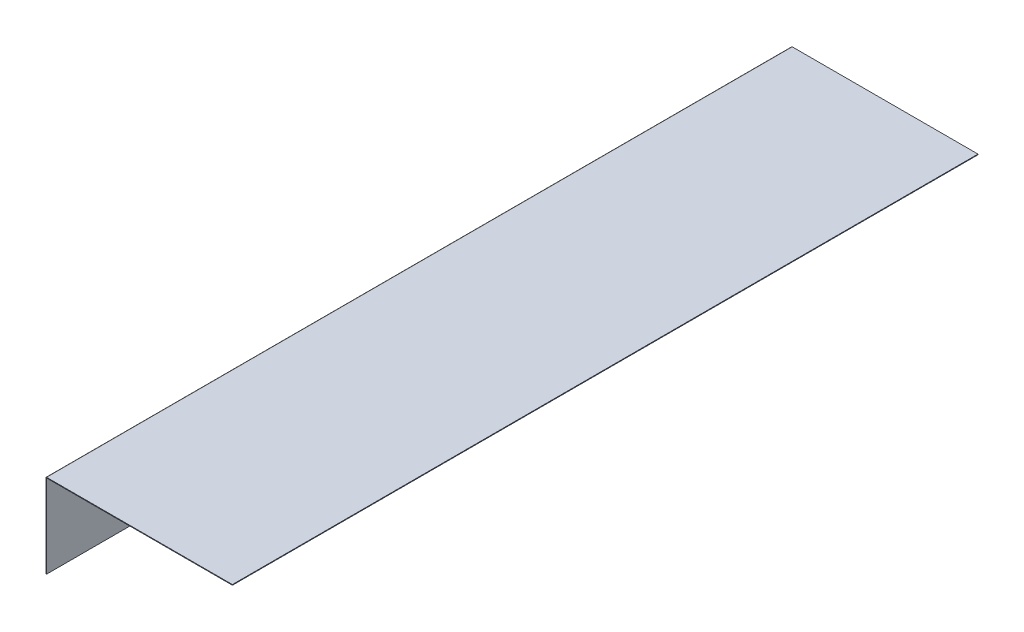
ISO-10303-21;
HEADER;
FILE_DESCRIPTION(('STEP AP214'),'2;1');
FILE_NAME('part.step','',(''),(''),'','','');
FILE_SCHEMA(('AUTOMOTIVE_DESIGN { 1 0 10303 214 1 1 1 1 }'));
ENDSEC;
DATA;
#1=APPLICATION_CONTEXT('core data for automotive mechanical design processes');
#2=APPLICATION_PROTOCOL_DEFINITION('international standard','automotive_design',2000,#1);
#3=PRODUCT_CONTEXT('',#1,'mechanical');
#4=PRODUCT('Part','Part','',(#3));
#5=PRODUCT_RELATED_PRODUCT_CATEGORY('part','',(#4));
#6=PRODUCT_DEFINITION_FORMATION('','',#4);
#7=PRODUCT_DEFINITION_CONTEXT('part definition',#1,'design');
#8=PRODUCT_DEFINITION('design','',#6,#7);
#9=PRODUCT_DEFINITION_SHAPE('','',#8);
#10=(LENGTH_UNIT() NAMED_UNIT(*) SI_UNIT(.MILLI.,.METRE.));
#11=(NAMED_UNIT(*) PLANE_ANGLE_UNIT() SI_UNIT($,.RADIAN.));
#12=(NAMED_UNIT(*) SI_UNIT($,.STERADIAN.) SOLID_ANGLE_UNIT());
#13=UNCERTAINTY_MEASURE_WITH_UNIT(LENGTH_MEASURE(1.E-05),#10,'distance_accuracy_value','');
#14=(GEOMETRIC_REPRESENTATION_CONTEXT(3) GLOBAL_UNCERTAINTY_ASSIGNED_CONTEXT((#13)) GLOBAL_UNIT_ASSIGNED_CONTEXT((#10,
#11,#12)) REPRESENTATION_CONTEXT('',''));
#15=CARTESIAN_POINT('',(0.,0.,0.));
#16=DIRECTION('',(0.,0.,1.));
#17=DIRECTION('',(1.,0.,0.));
#18=AXIS2_PLACEMENT_3D('',#15,#16,#17);
#19=CARTESIAN_POINT('',(1.,0.,1200.));
#20=DIRECTION('',(0.,1.,0.));
#21=DIRECTION('',(-1.,0.,0.));
#22=AXIS2_PLACEMENT_3D('',#19,#20,#21);
#23=PLANE('',#22);
#24=DIRECTION('',(1.,0.,0.));
#25=VECTOR('',#24,1.);
#26=CARTESIAN_POINT('',(1.,0.,0.));
#27=LINE('',#26,#25);
#28=CARTESIAN_POINT('',(0.,0.,0.));
#29=VERTEX_POINT('',#28);
#30=CARTESIAN_POINT('',(1.,0.,0.));
#31=VERTEX_POINT('',#30);
#32=EDGE_CURVE('E114',#29,#31,#27,.T.);
#33=ORIENTED_EDGE('',*,*,#32,.T.);
#34=DIRECTION('',(0.,0.,-1.));
#35=VECTOR('',#34,1.);
#36=CARTESIAN_POINT('',(1.,0.,1200.));
#37=LINE('',#36,#35);
#38=CARTESIAN_POINT('',(1.,0.,1200.));
#39=VERTEX_POINT('',#38);
#40=EDGE_CURVE('E98',#39,#31,#37,.T.);
#41=ORIENTED_EDGE('',*,*,#40,.F.);
#42=DIRECTION('',(1.,0.,0.));
#43=VECTOR('',#42,1.);
#44=CARTESIAN_POINT('',(1.,0.,1200.));
#45=LINE('',#44,#43);
#46=CARTESIAN_POINT('',(0.,0.,1200.));
#47=VERTEX_POINT('',#46);
#48=EDGE_CURVE('E101',#47,#39,#45,.T.);
#49=ORIENTED_EDGE('',*,*,#48,.F.);
#50=DIRECTION('',(0.,0.,-1.));
#51=VECTOR('',#50,1.);
#52=CARTESIAN_POINT('',(0.,0.,1200.));
#53=LINE('',#52,#51);
#54=EDGE_CURVE('E155',#47,#29,#53,.T.);
#55=ORIENTED_EDGE('',*,*,#54,.T.);
#56=EDGE_LOOP('',(#33,#41,#49,#55));
#57=FACE_BOUND('',#56,.T.);
#58=ADVANCED_FACE('F32',(#57),#23,.F.);
#59=CARTESIAN_POINT('',(1.,134.,1200.));
#60=DIRECTION('',(-1.,0.,0.));
#61=DIRECTION('',(0.,-1.,0.));
#62=AXIS2_PLACEMENT_3D('',#59,#60,#61);
#63=PLANE('',#62);
#64=DIRECTION('',(0.,1.,0.));
#65=VECTOR('',#64,1.);
#66=CARTESIAN_POINT('',(1.,134.,0.));
#67=LINE('',#66,#65);
#68=CARTESIAN_POINT('',(1.,133.,0.));
#69=VERTEX_POINT('',#68);
#70=EDGE_CURVE('E138',#31,#69,#67,.T.);
#71=ORIENTED_EDGE('',*,*,#70,.T.);
#72=DIRECTION('',(0.,0.,-1.));
#73=VECTOR('',#72,1.);
#74=CARTESIAN_POINT('',(1.,133.,1200.));
#75=LINE('',#74,#73);
#76=CARTESIAN_POINT('',(1.,133.,1200.));
#77=VERTEX_POINT('',#76);
#78=EDGE_CURVE('E53',#69,#77,#75,.F.);
#79=ORIENTED_EDGE('',*,*,#78,.T.);
#80=DIRECTION('',(0.,1.,0.));
#81=VECTOR('',#80,1.);
#82=CARTESIAN_POINT('',(1.,134.,1200.));
#83=LINE('',#82,#81);
#84=EDGE_CURVE('E94',#39,#77,#83,.T.);
#85=ORIENTED_EDGE('',*,*,#84,.F.);
#86=ORIENTED_EDGE('',*,*,#40,.T.);
#87=EDGE_LOOP('',(#71,#79,#85,#86));
#88=FACE_BOUND('',#87,.T.);
#89=ADVANCED_FACE('F96',(#88),#63,.F.);
#90=CARTESIAN_POINT('',(300.,134.,1200.));
#91=DIRECTION('',(0.,1.,0.));
#92=DIRECTION('',(-1.,0.,0.));
#93=AXIS2_PLACEMENT_3D('',#90,#91,#92);
#94=PLANE('',#93);
#95=DIRECTION('',(1.,0.,0.));
#96=VECTOR('',#95,1.);
#97=CARTESIAN_POINT('',(300.,134.,1200.));
#98=LINE('',#97,#96);
#99=CARTESIAN_POINT('',(2.,134.,1200.));
#100=VERTEX_POINT('',#99);
#101=CARTESIAN_POINT('',(300.,134.,1200.));
#102=VERTEX_POINT('',#101);
#103=EDGE_CURVE('E100',#100,#102,#98,.T.);
#104=ORIENTED_EDGE('',*,*,#103,.F.);
#105=DIRECTION('',(0.,0.,-1.));
#106=VECTOR('',#105,1.);
#107=CARTESIAN_POINT('',(2.,134.,0.));
#108=LINE('',#107,#106);
#109=CARTESIAN_POINT('',(2.,134.,0.));
#110=VERTEX_POINT('',#109);
#111=EDGE_CURVE('E131',#100,#110,#108,.T.);
#112=ORIENTED_EDGE('',*,*,#111,.T.);
#113=DIRECTION('',(1.,0.,0.));
#114=VECTOR('',#113,1.);
#115=CARTESIAN_POINT('',(300.,134.,0.));
#116=LINE('',#115,#114);
#117=CARTESIAN_POINT('',(300.,134.,0.));
#118=VERTEX_POINT('',#117);
#119=EDGE_CURVE('E140',#110,#118,#116,.T.);
#120=ORIENTED_EDGE('',*,*,#119,.T.);
#121=DIRECTION('',(0.,0.,-1.));
#122=VECTOR('',#121,1.);
#123=CARTESIAN_POINT('',(300.,134.,1200.));
#124=LINE('',#123,#122);
#125=EDGE_CURVE('E116',#102,#118,#124,.T.);
#126=ORIENTED_EDGE('',*,*,#125,.F.);
#127=EDGE_LOOP('',(#104,#112,#120,#126));
#128=FACE_BOUND('',#127,.T.);
#129=ADVANCED_FACE('F145',(#128),#94,.F.);
#130=CARTESIAN_POINT('',(300.,135.,1200.));
#131=DIRECTION('',(-1.,0.,0.));
#132=DIRECTION('',(0.,0.,1.));
#133=AXIS2_PLACEMENT_3D('',#130,#131,#132);
#134=PLANE('',#133);
#135=DIRECTION('',(0.,1.,0.));
#136=VECTOR('',#135,1.);
#137=CARTESIAN_POINT('',(300.,135.,0.));
#138=LINE('',#137,#136);
#139=CARTESIAN_POINT('',(300.,135.,0.));
#140=VERTEX_POINT('',#139);
#141=EDGE_CURVE('E158',#118,#140,#138,.T.);
#142=ORIENTED_EDGE('',*,*,#141,.T.);
#143=DIRECTION('',(0.,0.,-1.));
#144=VECTOR('',#143,1.);
#145=CARTESIAN_POINT('',(300.,135.,1200.));
#146=LINE('',#145,#144);
#147=CARTESIAN_POINT('',(300.,135.,1200.));
#148=VERTEX_POINT('',#147);
#149=EDGE_CURVE('E122',#148,#140,#146,.T.);
#150=ORIENTED_EDGE('',*,*,#149,.F.);
#151=DIRECTION('',(0.,1.,0.));
#152=VECTOR('',#151,1.);
#153=CARTESIAN_POINT('',(300.,135.,1200.));
#154=LINE('',#153,#152);
#155=EDGE_CURVE('E148',#102,#148,#154,.T.);
#156=ORIENTED_EDGE('',*,*,#155,.F.);
#157=ORIENTED_EDGE('',*,*,#125,.T.);
#158=EDGE_LOOP('',(#142,#150,#156,#157));
#159=FACE_BOUND('',#158,.T.);
#160=ADVANCED_FACE('F185',(#159),#134,.F.);
#161=CARTESIAN_POINT('',(0.,135.,1200.));
#162=DIRECTION('',(0.,-1.,0.));
#163=DIRECTION('',(0.,0.,-1.));
#164=AXIS2_PLACEMENT_3D('',#161,#162,#163);
#165=PLANE('',#164);
#166=DIRECTION('',(-1.,0.,0.));
#167=VECTOR('',#166,1.);
#168=CARTESIAN_POINT('',(0.,135.,0.));
#169=LINE('',#168,#167);
#170=CARTESIAN_POINT('',(1.,135.,0.));
#171=VERTEX_POINT('',#170);
#172=EDGE_CURVE('E160',#140,#171,#169,.T.);
#173=ORIENTED_EDGE('',*,*,#172,.T.);
#174=DIRECTION('',(0.,0.,-1.));
#175=VECTOR('',#174,1.);
#176=CARTESIAN_POINT('',(1.,135.,1200.));
#177=LINE('',#176,#175);
#178=CARTESIAN_POINT('',(1.,135.,1200.));
#179=VERTEX_POINT('',#178);
#180=EDGE_CURVE('E127',#171,#179,#177,.F.);
#181=ORIENTED_EDGE('',*,*,#180,.T.);
#182=DIRECTION('',(-1.,0.,0.));
#183=VECTOR('',#182,1.);
#184=CARTESIAN_POINT('',(0.,135.,1200.));
#185=LINE('',#184,#183);
#186=EDGE_CURVE('E150',#148,#179,#185,.T.);
#187=ORIENTED_EDGE('',*,*,#186,.F.);
#188=ORIENTED_EDGE('',*,*,#149,.T.);
#189=EDGE_LOOP('',(#173,#181,#187,#188));
#190=FACE_BOUND('',#189,.T.);
#191=ADVANCED_FACE('F169',(#190),#165,.F.);
#192=CARTESIAN_POINT('',(0.,0.,1200.));
#193=DIRECTION('',(1.,0.,0.));
#194=DIRECTION('',(0.,0.,-1.));
#195=AXIS2_PLACEMENT_3D('',#192,#193,#194);
#196=PLANE('',#195);
#197=DIRECTION('',(0.,-1.,0.));
#198=VECTOR('',#197,1.);
#199=CARTESIAN_POINT('',(0.,0.,1200.));
#200=LINE('',#199,#198);
#201=CARTESIAN_POINT('',(0.,134.,1200.));
#202=VERTEX_POINT('',#201);
#203=EDGE_CURVE('E107',#202,#47,#200,.T.);
#204=ORIENTED_EDGE('',*,*,#203,.F.);
#205=DIRECTION('',(0.,0.,-1.));
#206=VECTOR('',#205,1.);
#207=CARTESIAN_POINT('',(0.,134.,1200.));
#208=LINE('',#207,#206);
#209=CARTESIAN_POINT('',(0.,134.,0.));
#210=VERTEX_POINT('',#209);
#211=EDGE_CURVE('E115',#202,#210,#208,.T.);
#212=ORIENTED_EDGE('',*,*,#211,.T.);
#213=DIRECTION('',(0.,-1.,0.));
#214=VECTOR('',#213,1.);
#215=CARTESIAN_POINT('',(0.,0.,0.));
#216=LINE('',#215,#214);
#217=EDGE_CURVE('E111',#210,#29,#216,.T.);
#218=ORIENTED_EDGE('',*,*,#217,.T.);
#219=ORIENTED_EDGE('',*,*,#54,.F.);
#220=EDGE_LOOP('',(#204,#212,#218,#219));
#221=FACE_BOUND('',#220,.T.);
#222=ADVANCED_FACE('F177',(#221),#196,.F.);
#223=CARTESIAN_POINT('',(0.,0.,1200.));
#224=DIRECTION('',(0.,0.,-1.));
#225=DIRECTION('',(-1.,0.,0.));
#226=AXIS2_PLACEMENT_3D('',#223,#224,#225);
#227=PLANE('',#226);
#228=ORIENTED_EDGE('',*,*,#186,.T.);
#229=CARTESIAN_POINT('',(1.,134.,1200.));
#230=DIRECTION('',(0.,0.,-1.));
#231=DIRECTION('',(-1.,0.,0.));
#232=AXIS2_PLACEMENT_3D('',#229,#230,#231);
#233=CIRCLE('',#232,1.);
#234=EDGE_CURVE('E129',#179,#202,#233,.F.);
#235=ORIENTED_EDGE('',*,*,#234,.T.);
#236=ORIENTED_EDGE('',*,*,#203,.T.);
#237=ORIENTED_EDGE('',*,*,#48,.T.);
#238=ORIENTED_EDGE('',*,*,#84,.T.);
#239=CARTESIAN_POINT('',(2.,133.,1200.));
#240=DIRECTION('',(0.,0.,-1.));
#241=DIRECTION('',(-1.,0.,0.));
#242=AXIS2_PLACEMENT_3D('',#239,#240,#241);
#243=CIRCLE('',#242,1.);
#244=EDGE_CURVE('E11',#77,#100,#243,.T.);
#245=ORIENTED_EDGE('',*,*,#244,.T.);
#246=ORIENTED_EDGE('',*,*,#103,.T.);
#247=ORIENTED_EDGE('',*,*,#155,.T.);
#248=EDGE_LOOP('',(#228,#235,#236,#237,#238,#245,#246,#247));
#249=FACE_BOUND('',#248,.T.);
#250=ADVANCED_FACE('F105',(#249),#227,.F.);
#251=CARTESIAN_POINT('',(0.,0.,0.));
#252=DIRECTION('',(0.,0.,-1.));
#253=DIRECTION('',(-1.,0.,0.));
#254=AXIS2_PLACEMENT_3D('',#251,#252,#253);
#255=PLANE('',#254);
#256=ORIENTED_EDGE('',*,*,#217,.F.);
#257=CARTESIAN_POINT('',(1.,134.,0.));
#258=DIRECTION('',(0.,0.,-1.));
#259=DIRECTION('',(-1.,0.,0.));
#260=AXIS2_PLACEMENT_3D('',#257,#258,#259);
#261=CIRCLE('',#260,1.);
#262=EDGE_CURVE('E119',#210,#171,#261,.T.);
#263=ORIENTED_EDGE('',*,*,#262,.T.);
#264=ORIENTED_EDGE('',*,*,#172,.F.);
#265=ORIENTED_EDGE('',*,*,#141,.F.);
#266=ORIENTED_EDGE('',*,*,#119,.F.);
#267=CARTESIAN_POINT('',(2.,133.,0.));
#268=DIRECTION('',(0.,0.,-1.));
#269=DIRECTION('',(-1.,0.,0.));
#270=AXIS2_PLACEMENT_3D('',#267,#268,#269);
#271=CIRCLE('',#270,1.);
#272=EDGE_CURVE('E40',#110,#69,#271,.F.);
#273=ORIENTED_EDGE('',*,*,#272,.T.);
#274=ORIENTED_EDGE('',*,*,#70,.F.);
#275=ORIENTED_EDGE('',*,*,#32,.F.);
#276=EDGE_LOOP('',(#256,#263,#264,#265,#266,#273,#274,#275));
#277=FACE_BOUND('',#276,.T.);
#278=ADVANCED_FACE('F137',(#277),#255,.T.);
#279=CARTESIAN_POINT('',(1.,134.,1200.));
#280=DIRECTION('',(0.,0.,-1.));
#281=DIRECTION('',(-1.,0.,0.));
#282=AXIS2_PLACEMENT_3D('',#279,#280,#281);
#283=CYLINDRICAL_SURFACE('',#282,1.);
#284=ORIENTED_EDGE('',*,*,#234,.F.);
#285=ORIENTED_EDGE('',*,*,#180,.F.);
#286=ORIENTED_EDGE('',*,*,#262,.F.);
#287=ORIENTED_EDGE('',*,*,#211,.F.);
#288=EDGE_LOOP('',(#284,#285,#286,#287));
#289=FACE_BOUND('',#288,.T.);
#290=ADVANCED_FACE('F175',(#289),#283,.T.);
#291=CARTESIAN_POINT('',(2.,133.,1200.));
#292=DIRECTION('',(0.,0.,1.));
#293=DIRECTION('',(1.,0.,0.));
#294=AXIS2_PLACEMENT_3D('',#291,#292,#293);
#295=CYLINDRICAL_SURFACE('',#294,1.);
#296=ORIENTED_EDGE('',*,*,#244,.F.);
#297=ORIENTED_EDGE('',*,*,#78,.F.);
#298=ORIENTED_EDGE('',*,*,#272,.F.);
#299=ORIENTED_EDGE('',*,*,#111,.F.);
#300=EDGE_LOOP('',(#296,#297,#298,#299));
#301=FACE_BOUND('',#300,.T.);
#302=ADVANCED_FACE('F34',(#301),#295,.F.);
#303=CLOSED_SHELL('',(#58,#89,#129,#160,#191,#222,#250,#278,#290,#302));
#304=MANIFOLD_SOLID_BREP('B2',#303);
#305=ADVANCED_BREP_SHAPE_REPRESENTATION('',(#18,#304),#14);
#306=SHAPE_DEFINITION_REPRESENTATION(#9,#305);
ENDSEC;
END-ISO-10303-21;
